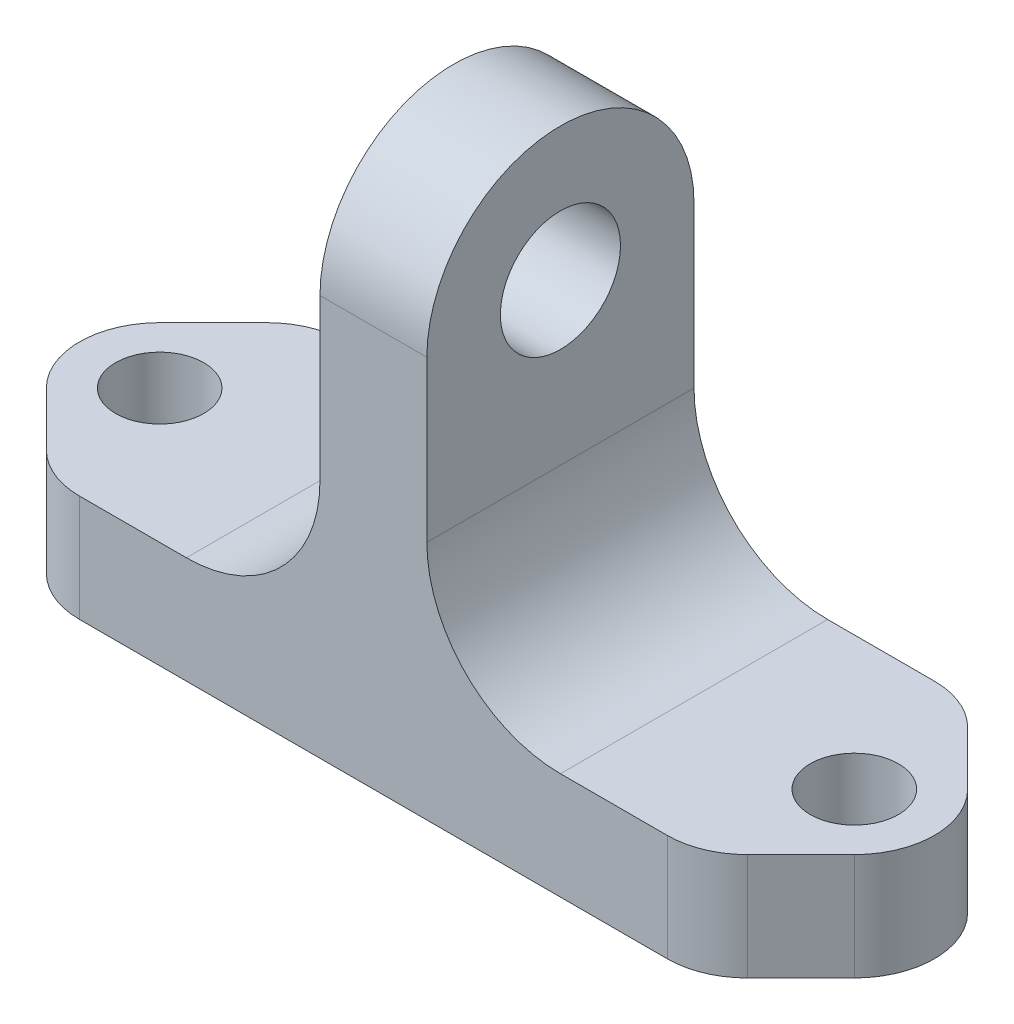
ISO-10303-21;
HEADER;
FILE_DESCRIPTION(('STEP AP214'),'2;1');
FILE_NAME('part.step','',(''),(''),'','','');
FILE_SCHEMA(('AUTOMOTIVE_DESIGN { 1 0 10303 214 1 1 1 1 }'));
ENDSEC;
DATA;
#1=APPLICATION_CONTEXT('core data for automotive mechanical design processes');
#2=APPLICATION_PROTOCOL_DEFINITION('international standard','automotive_design',2000,#1);
#3=PRODUCT_CONTEXT('',#1,'mechanical');
#4=PRODUCT('Part','Part','',(#3));
#5=PRODUCT_RELATED_PRODUCT_CATEGORY('part','',(#4));
#6=PRODUCT_DEFINITION_FORMATION('','',#4);
#7=PRODUCT_DEFINITION_CONTEXT('part definition',#1,'design');
#8=PRODUCT_DEFINITION('design','',#6,#7);
#9=PRODUCT_DEFINITION_SHAPE('','',#8);
#10=(LENGTH_UNIT() NAMED_UNIT(*) SI_UNIT(.MILLI.,.METRE.));
#11=(NAMED_UNIT(*) PLANE_ANGLE_UNIT() SI_UNIT($,.RADIAN.));
#12=(NAMED_UNIT(*) SI_UNIT($,.STERADIAN.) SOLID_ANGLE_UNIT());
#13=UNCERTAINTY_MEASURE_WITH_UNIT(LENGTH_MEASURE(1.E-05),#10,'distance_accuracy_value','');
#14=(GEOMETRIC_REPRESENTATION_CONTEXT(3) GLOBAL_UNCERTAINTY_ASSIGNED_CONTEXT((#13)) GLOBAL_UNIT_ASSIGNED_CONTEXT((#10,
#11,#12)) REPRESENTATION_CONTEXT('',''));
#15=CARTESIAN_POINT('',(0.,0.,0.));
#16=DIRECTION('',(0.,0.,1.));
#17=DIRECTION('',(1.,0.,0.));
#18=AXIS2_PLACEMENT_3D('',#15,#16,#17);
#19=CARTESIAN_POINT('',(-16.,0.,5.));
#20=DIRECTION('',(0.,1.,0.));
#21=DIRECTION('',(-1.,0.,0.));
#22=AXIS2_PLACEMENT_3D('',#19,#20,#21);
#23=PLANE('',#22);
#24=CARTESIAN_POINT('',(-13.,0.,0.));
#25=DIRECTION('',(0.,1.,0.));
#26=DIRECTION('',(0.,0.,1.));
#27=AXIS2_PLACEMENT_3D('',#24,#25,#26);
#28=CIRCLE('',#27,1.65);
#29=CARTESIAN_POINT('',(-13.,0.,1.65));
#30=VERTEX_POINT('',#29);
#31=EDGE_CURVE('E262',#30,#30,#28,.T.);
#32=ORIENTED_EDGE('',*,*,#31,.T.);
#33=EDGE_LOOP('',(#32));
#34=FACE_BOUND('',#33,.T.);
#35=CARTESIAN_POINT('',(13.,0.,0.));
#36=DIRECTION('',(0.,1.,0.));
#37=DIRECTION('',(0.,0.,1.));
#38=AXIS2_PLACEMENT_3D('',#35,#36,#37);
#39=CIRCLE('',#38,1.65);
#40=CARTESIAN_POINT('',(13.,0.,1.65));
#41=VERTEX_POINT('',#40);
#42=EDGE_CURVE('E248',#41,#41,#39,.T.);
#43=ORIENTED_EDGE('',*,*,#42,.T.);
#44=EDGE_LOOP('',(#43));
#45=FACE_BOUND('',#44,.T.);
#46=CARTESIAN_POINT('',(11.,0.,-2.));
#47=DIRECTION('',(0.,-1.,0.));
#48=DIRECTION('',(0.,0.,1.));
#49=AXIS2_PLACEMENT_3D('',#46,#47,#48);
#50=CIRCLE('',#49,3.);
#51=CARTESIAN_POINT('',(11.,0.,-5.));
#52=VERTEX_POINT('',#51);
#53=CARTESIAN_POINT('',(13.1213203435596,0.,-4.12132034355964));
#54=VERTEX_POINT('',#53);
#55=EDGE_CURVE('E166',#52,#54,#50,.T.);
#56=ORIENTED_EDGE('',*,*,#55,.T.);
#57=DIRECTION('',(-0.707106781186547,0.,-0.707106781186548));
#58=VECTOR('',#57,1.);
#59=CARTESIAN_POINT('',(8.62132034355965,0.,-8.62132034355964));
#60=LINE('',#59,#58);
#61=CARTESIAN_POINT('',(15.1213203435596,0.,-2.12132034355964));
#62=VERTEX_POINT('',#61);
#63=EDGE_CURVE('E172',#62,#54,#60,.T.);
#64=ORIENTED_EDGE('',*,*,#63,.F.);
#65=CARTESIAN_POINT('',(13.,0.,0.));
#66=DIRECTION('',(0.,-1.,0.));
#67=DIRECTION('',(0.,0.,1.));
#68=AXIS2_PLACEMENT_3D('',#65,#66,#67);
#69=CIRCLE('',#68,3.);
#70=CARTESIAN_POINT('',(15.1213203435596,0.,2.12132034355964));
#71=VERTEX_POINT('',#70);
#72=EDGE_CURVE('E322',#62,#71,#69,.T.);
#73=ORIENTED_EDGE('',*,*,#72,.T.);
#74=DIRECTION('',(-0.707106781186547,0.,0.707106781186548));
#75=VECTOR('',#74,1.);
#76=CARTESIAN_POINT('',(8.62132034355965,0.,8.62132034355964));
#77=LINE('',#76,#75);
#78=CARTESIAN_POINT('',(13.1213203435596,0.,4.12132034355964));
#79=VERTEX_POINT('',#78);
#80=EDGE_CURVE('E319',#71,#79,#77,.T.);
#81=ORIENTED_EDGE('',*,*,#80,.T.);
#82=CARTESIAN_POINT('',(11.,0.,2.));
#83=DIRECTION('',(0.,-1.,0.));
#84=DIRECTION('',(0.,0.,1.));
#85=AXIS2_PLACEMENT_3D('',#82,#83,#84);
#86=CIRCLE('',#85,3.);
#87=CARTESIAN_POINT('',(11.,0.,5.));
#88=VERTEX_POINT('',#87);
#89=EDGE_CURVE('E325',#79,#88,#86,.T.);
#90=ORIENTED_EDGE('',*,*,#89,.T.);
#91=DIRECTION('',(1.,0.,0.));
#92=VECTOR('',#91,1.);
#93=CARTESIAN_POINT('',(-16.,0.,5.));
#94=LINE('',#93,#92);
#95=CARTESIAN_POINT('',(-11.,0.,5.));
#96=VERTEX_POINT('',#95);
#97=EDGE_CURVE('E238',#96,#88,#94,.T.);
#98=ORIENTED_EDGE('',*,*,#97,.F.);
#99=CARTESIAN_POINT('',(-11.,0.,2.));
#100=DIRECTION('',(0.,1.,0.));
#101=DIRECTION('',(0.,0.,1.));
#102=AXIS2_PLACEMENT_3D('',#99,#100,#101);
#103=CIRCLE('',#102,3.);
#104=CARTESIAN_POINT('',(-13.1213203435596,0.,4.12132034355964));
#105=VERTEX_POINT('',#104);
#106=EDGE_CURVE('E58',#105,#96,#103,.T.);
#107=ORIENTED_EDGE('',*,*,#106,.F.);
#108=DIRECTION('',(0.707106781186547,0.,0.707106781186548));
#109=VECTOR('',#108,1.);
#110=CARTESIAN_POINT('',(-8.62132034355965,0.,8.62132034355964));
#111=LINE('',#110,#109);
#112=CARTESIAN_POINT('',(-15.1213203435596,0.,2.12132034355964));
#113=VERTEX_POINT('',#112);
#114=EDGE_CURVE('E283',#113,#105,#111,.T.);
#115=ORIENTED_EDGE('',*,*,#114,.F.);
#116=CARTESIAN_POINT('',(-13.,0.,0.));
#117=DIRECTION('',(0.,1.,0.));
#118=DIRECTION('',(0.,0.,1.));
#119=AXIS2_PLACEMENT_3D('',#116,#117,#118);
#120=CIRCLE('',#119,3.);
#121=CARTESIAN_POINT('',(-15.1213203435596,0.,-2.12132034355964));
#122=VERTEX_POINT('',#121);
#123=EDGE_CURVE('E280',#122,#113,#120,.T.);
#124=ORIENTED_EDGE('',*,*,#123,.F.);
#125=DIRECTION('',(0.707106781186547,0.,-0.707106781186548));
#126=VECTOR('',#125,1.);
#127=CARTESIAN_POINT('',(-8.62132034355965,0.,-8.62132034355964));
#128=LINE('',#127,#126);
#129=CARTESIAN_POINT('',(-13.1213203435596,0.,-4.12132034355964));
#130=VERTEX_POINT('',#129);
#131=EDGE_CURVE('E302',#122,#130,#128,.T.);
#132=ORIENTED_EDGE('',*,*,#131,.T.);
#133=CARTESIAN_POINT('',(-11.,0.,-2.));
#134=DIRECTION('',(0.,1.,0.));
#135=DIRECTION('',(0.,0.,1.));
#136=AXIS2_PLACEMENT_3D('',#133,#134,#135);
#137=CIRCLE('',#136,3.);
#138=CARTESIAN_POINT('',(-11.,0.,-5.));
#139=VERTEX_POINT('',#138);
#140=EDGE_CURVE('E305',#139,#130,#137,.T.);
#141=ORIENTED_EDGE('',*,*,#140,.F.);
#142=DIRECTION('',(1.,0.,0.));
#143=VECTOR('',#142,1.);
#144=CARTESIAN_POINT('',(-16.,0.,-5.));
#145=LINE('',#144,#143);
#146=EDGE_CURVE('E186',#139,#52,#145,.T.);
#147=ORIENTED_EDGE('',*,*,#146,.T.);
#148=EDGE_LOOP('',(#56,#64,#73,#81,#90,#98,#107,#115,#124,#132,#141,#147));
#149=FACE_BOUND('',#148,.T.);
#150=ADVANCED_FACE('F35',(#34,#45,#149),#23,.F.);
#151=CARTESIAN_POINT('',(16.,4.,5.));
#152=DIRECTION('',(0.,-1.,0.));
#153=DIRECTION('',(1.,0.,0.));
#154=AXIS2_PLACEMENT_3D('',#151,#152,#153);
#155=PLANE('',#154);
#156=CARTESIAN_POINT('',(13.,4.00000000000001,0.));
#157=DIRECTION('',(0.,1.,0.));
#158=DIRECTION('',(0.,0.,1.));
#159=AXIS2_PLACEMENT_3D('',#156,#157,#158);
#160=CIRCLE('',#159,1.64999999999999);
#161=CARTESIAN_POINT('',(13.,4.00000000000001,1.64999999999999));
#162=VERTEX_POINT('',#161);
#163=EDGE_CURVE('E251',#162,#162,#160,.T.);
#164=ORIENTED_EDGE('',*,*,#163,.F.);
#165=EDGE_LOOP('',(#164));
#166=FACE_BOUND('',#165,.T.);
#167=CARTESIAN_POINT('',(11.,4.,-2.));
#168=DIRECTION('',(0.,-1.,0.));
#169=DIRECTION('',(1.,0.,0.));
#170=AXIS2_PLACEMENT_3D('',#167,#168,#169);
#171=CIRCLE('',#170,3.);
#172=CARTESIAN_POINT('',(13.1213203435596,4.,-4.12132034355964));
#173=VERTEX_POINT('',#172);
#174=CARTESIAN_POINT('',(11.,4.,-5.));
#175=VERTEX_POINT('',#174);
#176=EDGE_CURVE('E163',#173,#175,#171,.F.);
#177=ORIENTED_EDGE('',*,*,#176,.T.);
#178=DIRECTION('',(-1.,0.,0.));
#179=VECTOR('',#178,1.);
#180=CARTESIAN_POINT('',(16.,4.,-5.));
#181=LINE('',#180,#179);
#182=CARTESIAN_POINT('',(7.,4.,-5.));
#183=VERTEX_POINT('',#182);
#184=EDGE_CURVE('E177',#175,#183,#181,.T.);
#185=ORIENTED_EDGE('',*,*,#184,.T.);
#186=DIRECTION('',(0.,0.,-1.));
#187=VECTOR('',#186,1.);
#188=CARTESIAN_POINT('',(7.,4.,5.));
#189=LINE('',#188,#187);
#190=CARTESIAN_POINT('',(7.,4.,5.));
#191=VERTEX_POINT('',#190);
#192=EDGE_CURVE('E214',#183,#191,#189,.F.);
#193=ORIENTED_EDGE('',*,*,#192,.T.);
#194=DIRECTION('',(-1.,0.,0.));
#195=VECTOR('',#194,1.);
#196=CARTESIAN_POINT('',(16.,4.,5.));
#197=LINE('',#196,#195);
#198=CARTESIAN_POINT('',(11.,4.,5.));
#199=VERTEX_POINT('',#198);
#200=EDGE_CURVE('E255',#199,#191,#197,.T.);
#201=ORIENTED_EDGE('',*,*,#200,.F.);
#202=CARTESIAN_POINT('',(11.,4.,2.));
#203=DIRECTION('',(0.,-1.,0.));
#204=DIRECTION('',(1.,0.,0.));
#205=AXIS2_PLACEMENT_3D('',#202,#203,#204);
#206=CIRCLE('',#205,3.);
#207=CARTESIAN_POINT('',(13.1213203435596,4.,4.12132034355964));
#208=VERTEX_POINT('',#207);
#209=EDGE_CURVE('E50',#199,#208,#206,.F.);
#210=ORIENTED_EDGE('',*,*,#209,.T.);
#211=DIRECTION('',(0.707106781186547,0.,-0.707106781186548));
#212=VECTOR('',#211,1.);
#213=CARTESIAN_POINT('',(8.62132034355965,4.,8.62132034355964));
#214=LINE('',#213,#212);
#215=CARTESIAN_POINT('',(15.1213203435596,4.,2.12132034355964));
#216=VERTEX_POINT('',#215);
#217=EDGE_CURVE('E310',#208,#216,#214,.T.);
#218=ORIENTED_EDGE('',*,*,#217,.T.);
#219=CARTESIAN_POINT('',(13.,4.,0.));
#220=DIRECTION('',(0.,-1.,0.));
#221=DIRECTION('',(1.,0.,0.));
#222=AXIS2_PLACEMENT_3D('',#219,#220,#221);
#223=CIRCLE('',#222,3.);
#224=CARTESIAN_POINT('',(15.1213203435596,4.,-2.12132034355964));
#225=VERTEX_POINT('',#224);
#226=EDGE_CURVE('E329',#216,#225,#223,.F.);
#227=ORIENTED_EDGE('',*,*,#226,.T.);
#228=DIRECTION('',(0.707106781186547,0.,0.707106781186548));
#229=VECTOR('',#228,1.);
#230=CARTESIAN_POINT('',(8.62132034355965,4.,-8.62132034355964));
#231=LINE('',#230,#229);
#232=EDGE_CURVE('E180',#173,#225,#231,.T.);
#233=ORIENTED_EDGE('',*,*,#232,.F.);
#234=EDGE_LOOP('',(#177,#185,#193,#201,#210,#218,#227,#233));
#235=FACE_BOUND('',#234,.T.);
#236=ADVANCED_FACE('F175',(#166,#235),#155,.F.);
#237=CARTESIAN_POINT('',(2.,15.,0.));
#238=DIRECTION('',(-1.,0.,0.));
#239=DIRECTION('',(0.,0.,1.));
#240=AXIS2_PLACEMENT_3D('',#237,#238,#239);
#241=CYLINDRICAL_SURFACE('',#240,5.);
#242=DIRECTION('',(1.,0.,0.));
#243=VECTOR('',#242,1.);
#244=CARTESIAN_POINT('',(2.,15.,5.));
#245=LINE('',#244,#243);
#246=CARTESIAN_POINT('',(2.,15.,5.));
#247=VERTEX_POINT('',#246);
#248=CARTESIAN_POINT('',(-2.,15.,5.));
#249=VERTEX_POINT('',#248);
#250=EDGE_CURVE('E194',#247,#249,#245,.F.);
#251=ORIENTED_EDGE('',*,*,#250,.F.);
#252=CARTESIAN_POINT('',(2.,15.,0.));
#253=DIRECTION('',(-1.,0.,0.));
#254=DIRECTION('',(0.,0.,1.));
#255=AXIS2_PLACEMENT_3D('',#252,#253,#254);
#256=CIRCLE('',#255,5.);
#257=CARTESIAN_POINT('',(2.,15.,-5.));
#258=VERTEX_POINT('',#257);
#259=EDGE_CURVE('E201',#258,#247,#256,.F.);
#260=ORIENTED_EDGE('',*,*,#259,.F.);
#261=DIRECTION('',(-1.,0.,0.));
#262=VECTOR('',#261,1.);
#263=CARTESIAN_POINT('',(0.,15.,-5.));
#264=LINE('',#263,#262);
#265=CARTESIAN_POINT('',(-2.,15.,-5.));
#266=VERTEX_POINT('',#265);
#267=EDGE_CURVE('E197',#266,#258,#264,.F.);
#268=ORIENTED_EDGE('',*,*,#267,.F.);
#269=CARTESIAN_POINT('',(-2.,15.,0.));
#270=DIRECTION('',(1.,0.,0.));
#271=DIRECTION('',(0.,1.,0.));
#272=AXIS2_PLACEMENT_3D('',#269,#270,#271);
#273=CIRCLE('',#272,5.);
#274=EDGE_CURVE('E204',#249,#266,#273,.F.);
#275=ORIENTED_EDGE('',*,*,#274,.F.);
#276=EDGE_LOOP('',(#251,#260,#268,#275));
#277=FACE_BOUND('',#276,.T.);
#278=ADVANCED_FACE('F375',(#277),#241,.T.);
#279=CARTESIAN_POINT('',(-2.,20.,5.));
#280=DIRECTION('',(1.,0.,0.));
#281=DIRECTION('',(0.,1.,0.));
#282=AXIS2_PLACEMENT_3D('',#279,#280,#281);
#283=PLANE('',#282);
#284=CARTESIAN_POINT('',(-2.,15.,0.));
#285=DIRECTION('',(1.,0.,0.));
#286=DIRECTION('',(0.,1.,0.));
#287=AXIS2_PLACEMENT_3D('',#284,#285,#286);
#288=CIRCLE('',#287,2.2479);
#289=CARTESIAN_POINT('',(-2.,17.2479,0.));
#290=VERTEX_POINT('',#289);
#291=EDGE_CURVE('E268',#290,#290,#288,.T.);
#292=ORIENTED_EDGE('',*,*,#291,.T.);
#293=EDGE_LOOP('',(#292));
#294=FACE_BOUND('',#293,.T.);
#295=DIRECTION('',(0.,-1.,0.));
#296=VECTOR('',#295,1.);
#297=CARTESIAN_POINT('',(-2.,20.,-5.));
#298=LINE('',#297,#296);
#299=CARTESIAN_POINT('',(-2.,9.,-5.));
#300=VERTEX_POINT('',#299);
#301=EDGE_CURVE('E243',#266,#300,#298,.T.);
#302=ORIENTED_EDGE('',*,*,#301,.T.);
#303=DIRECTION('',(0.,0.,-1.));
#304=VECTOR('',#303,1.);
#305=CARTESIAN_POINT('',(-2.,9.,5.));
#306=LINE('',#305,#304);
#307=CARTESIAN_POINT('',(-2.,9.,5.));
#308=VERTEX_POINT('',#307);
#309=EDGE_CURVE('E209',#300,#308,#306,.F.);
#310=ORIENTED_EDGE('',*,*,#309,.T.);
#311=DIRECTION('',(0.,-1.,0.));
#312=VECTOR('',#311,1.);
#313=CARTESIAN_POINT('',(-2.,20.,5.));
#314=LINE('',#313,#312);
#315=EDGE_CURVE('E188',#249,#308,#314,.T.);
#316=ORIENTED_EDGE('',*,*,#315,.F.);
#317=ORIENTED_EDGE('',*,*,#274,.T.);
#318=EDGE_LOOP('',(#302,#310,#316,#317));
#319=FACE_BOUND('',#318,.T.);
#320=ADVANCED_FACE('F246',(#294,#319),#283,.F.);
#321=CARTESIAN_POINT('',(-2.,4.,5.));
#322=DIRECTION('',(0.,-1.,0.));
#323=DIRECTION('',(1.,0.,0.));
#324=AXIS2_PLACEMENT_3D('',#321,#322,#323);
#325=PLANE('',#324);
#326=DIRECTION('',(-1.,0.,0.));
#327=VECTOR('',#326,1.);
#328=CARTESIAN_POINT('',(-2.,4.,-5.));
#329=LINE('',#328,#327);
#330=CARTESIAN_POINT('',(-7.,4.,-5.));
#331=VERTEX_POINT('',#330);
#332=CARTESIAN_POINT('',(-11.,4.,-5.));
#333=VERTEX_POINT('',#332);
#334=EDGE_CURVE('E190',#331,#333,#329,.T.);
#335=ORIENTED_EDGE('',*,*,#334,.T.);
#336=CARTESIAN_POINT('',(-11.,4.,-2.));
#337=DIRECTION('',(0.,-1.,0.));
#338=DIRECTION('',(1.,0.,0.));
#339=AXIS2_PLACEMENT_3D('',#336,#337,#338);
#340=CIRCLE('',#339,3.);
#341=CARTESIAN_POINT('',(-13.1213203435596,4.,-4.12132034355964));
#342=VERTEX_POINT('',#341);
#343=EDGE_CURVE('E308',#342,#333,#340,.T.);
#344=ORIENTED_EDGE('',*,*,#343,.F.);
#345=DIRECTION('',(-0.707106781186547,0.,0.707106781186548));
#346=VECTOR('',#345,1.);
#347=CARTESIAN_POINT('',(-8.62132034355965,4.,-8.62132034355964));
#348=LINE('',#347,#346);
#349=CARTESIAN_POINT('',(-15.1213203435596,4.,-2.12132034355964));
#350=VERTEX_POINT('',#349);
#351=EDGE_CURVE('E292',#342,#350,#348,.T.);
#352=ORIENTED_EDGE('',*,*,#351,.T.);
#353=CARTESIAN_POINT('',(-13.,4.,0.));
#354=DIRECTION('',(0.,-1.,0.));
#355=DIRECTION('',(1.,0.,0.));
#356=AXIS2_PLACEMENT_3D('',#353,#354,#355);
#357=CIRCLE('',#356,3.);
#358=CARTESIAN_POINT('',(-15.1213203435596,4.,2.12132034355964));
#359=VERTEX_POINT('',#358);
#360=EDGE_CURVE('E290',#359,#350,#357,.T.);
#361=ORIENTED_EDGE('',*,*,#360,.F.);
#362=DIRECTION('',(-0.707106781186547,0.,-0.707106781186548));
#363=VECTOR('',#362,1.);
#364=CARTESIAN_POINT('',(-8.62132034355965,4.,8.62132034355964));
#365=LINE('',#364,#363);
#366=CARTESIAN_POINT('',(-13.1213203435596,4.,4.12132034355964));
#367=VERTEX_POINT('',#366);
#368=EDGE_CURVE('E288',#367,#359,#365,.T.);
#369=ORIENTED_EDGE('',*,*,#368,.F.);
#370=CARTESIAN_POINT('',(-11.,4.,2.));
#371=DIRECTION('',(0.,-1.,0.));
#372=DIRECTION('',(1.,0.,0.));
#373=AXIS2_PLACEMENT_3D('',#370,#371,#372);
#374=CIRCLE('',#373,3.);
#375=CARTESIAN_POINT('',(-11.,4.,5.));
#376=VERTEX_POINT('',#375);
#377=EDGE_CURVE('E237',#376,#367,#374,.T.);
#378=ORIENTED_EDGE('',*,*,#377,.F.);
#379=DIRECTION('',(-1.,0.,0.));
#380=VECTOR('',#379,1.);
#381=CARTESIAN_POINT('',(-2.,4.,5.));
#382=LINE('',#381,#380);
#383=CARTESIAN_POINT('',(-7.,4.,5.));
#384=VERTEX_POINT('',#383);
#385=EDGE_CURVE('E225',#384,#376,#382,.T.);
#386=ORIENTED_EDGE('',*,*,#385,.F.);
#387=DIRECTION('',(0.,0.,-1.));
#388=VECTOR('',#387,1.);
#389=CARTESIAN_POINT('',(-7.,4.,-5.));
#390=LINE('',#389,#388);
#391=EDGE_CURVE('E206',#384,#331,#390,.T.);
#392=ORIENTED_EDGE('',*,*,#391,.T.);
#393=EDGE_LOOP('',(#335,#344,#352,#361,#369,#378,#386,#392));
#394=FACE_BOUND('',#393,.T.);
#395=CARTESIAN_POINT('',(-13.,4.,0.));
#396=DIRECTION('',(0.,1.,0.));
#397=DIRECTION('',(0.,0.,1.));
#398=AXIS2_PLACEMENT_3D('',#395,#396,#397);
#399=CIRCLE('',#398,1.64999999999999);
#400=CARTESIAN_POINT('',(-13.,4.,1.64999999999999));
#401=VERTEX_POINT('',#400);
#402=EDGE_CURVE('E265',#401,#401,#399,.T.);
#403=ORIENTED_EDGE('',*,*,#402,.F.);
#404=EDGE_LOOP('',(#403));
#405=FACE_BOUND('',#404,.T.);
#406=ADVANCED_FACE('F233',(#394,#405),#325,.F.);
#407=CARTESIAN_POINT('',(2.,4.,5.));
#408=DIRECTION('',(-1.,0.,0.));
#409=DIRECTION('',(0.,0.,1.));
#410=AXIS2_PLACEMENT_3D('',#407,#408,#409);
#411=PLANE('',#410);
#412=CARTESIAN_POINT('',(2.,15.,0.));
#413=DIRECTION('',(1.,0.,0.));
#414=DIRECTION('',(0.,0.,-1.));
#415=AXIS2_PLACEMENT_3D('',#412,#413,#414);
#416=CIRCLE('',#415,2.2479);
#417=CARTESIAN_POINT('',(2.,15.,-2.2479));
#418=VERTEX_POINT('',#417);
#419=EDGE_CURVE('E271',#418,#418,#416,.T.);
#420=ORIENTED_EDGE('',*,*,#419,.F.);
#421=EDGE_LOOP('',(#420));
#422=FACE_BOUND('',#421,.T.);
#423=DIRECTION('',(0.,1.,0.));
#424=VECTOR('',#423,1.);
#425=CARTESIAN_POINT('',(2.,4.,5.));
#426=LINE('',#425,#424);
#427=CARTESIAN_POINT('',(2.,9.,5.));
#428=VERTEX_POINT('',#427);
#429=EDGE_CURVE('E198',#428,#247,#426,.T.);
#430=ORIENTED_EDGE('',*,*,#429,.F.);
#431=DIRECTION('',(0.,0.,-1.));
#432=VECTOR('',#431,1.);
#433=CARTESIAN_POINT('',(2.,9.,-5.));
#434=LINE('',#433,#432);
#435=CARTESIAN_POINT('',(2.,9.,-5.));
#436=VERTEX_POINT('',#435);
#437=EDGE_CURVE('E211',#428,#436,#434,.T.);
#438=ORIENTED_EDGE('',*,*,#437,.T.);
#439=DIRECTION('',(0.,1.,0.));
#440=VECTOR('',#439,1.);
#441=CARTESIAN_POINT('',(2.,4.,-5.));
#442=LINE('',#441,#440);
#443=EDGE_CURVE('E185',#436,#258,#442,.T.);
#444=ORIENTED_EDGE('',*,*,#443,.T.);
#445=ORIENTED_EDGE('',*,*,#259,.T.);
#446=EDGE_LOOP('',(#430,#438,#444,#445));
#447=FACE_BOUND('',#446,.T.);
#448=ADVANCED_FACE('F371',(#422,#447),#411,.F.);
#449=CARTESIAN_POINT('',(0.,0.,5.));
#450=DIRECTION('',(0.,0.,1.));
#451=DIRECTION('',(1.,0.,0.));
#452=AXIS2_PLACEMENT_3D('',#449,#450,#451);
#453=PLANE('',#452);
#454=DIRECTION('',(0.,-1.,0.));
#455=VECTOR('',#454,1.);
#456=CARTESIAN_POINT('',(11.,20.001,5.));
#457=LINE('',#456,#455);
#458=EDGE_CURVE('E313',#199,#88,#457,.T.);
#459=ORIENTED_EDGE('',*,*,#458,.F.);
#460=ORIENTED_EDGE('',*,*,#200,.T.);
#461=CARTESIAN_POINT('',(7.,9.,5.));
#462=DIRECTION('',(0.,0.,1.));
#463=DIRECTION('',(1.,0.,0.));
#464=AXIS2_PLACEMENT_3D('',#461,#462,#463);
#465=CIRCLE('',#464,5.);
#466=EDGE_CURVE('E11',#191,#428,#465,.F.);
#467=ORIENTED_EDGE('',*,*,#466,.T.);
#468=ORIENTED_EDGE('',*,*,#429,.T.);
#469=ORIENTED_EDGE('',*,*,#250,.T.);
#470=ORIENTED_EDGE('',*,*,#315,.T.);
#471=CARTESIAN_POINT('',(-7.,9.,5.));
#472=DIRECTION('',(0.,0.,1.));
#473=DIRECTION('',(1.,0.,0.));
#474=AXIS2_PLACEMENT_3D('',#471,#472,#473);
#475=CIRCLE('',#474,5.);
#476=EDGE_CURVE('E218',#308,#384,#475,.F.);
#477=ORIENTED_EDGE('',*,*,#476,.T.);
#478=ORIENTED_EDGE('',*,*,#385,.T.);
#479=DIRECTION('',(0.,-1.,0.));
#480=VECTOR('',#479,1.);
#481=CARTESIAN_POINT('',(-11.,20.001,5.));
#482=LINE('',#481,#480);
#483=EDGE_CURVE('E278',#376,#96,#482,.T.);
#484=ORIENTED_EDGE('',*,*,#483,.T.);
#485=ORIENTED_EDGE('',*,*,#97,.T.);
#486=EDGE_LOOP('',(#459,#460,#467,#468,#469,#470,#477,#478,#484,#485));
#487=FACE_BOUND('',#486,.T.);
#488=ADVANCED_FACE('F224',(#487),#453,.T.);
#489=CARTESIAN_POINT('',(0.,0.,-5.));
#490=DIRECTION('',(0.,0.,1.));
#491=DIRECTION('',(1.,0.,0.));
#492=AXIS2_PLACEMENT_3D('',#489,#490,#491);
#493=PLANE('',#492);
#494=ORIENTED_EDGE('',*,*,#184,.F.);
#495=DIRECTION('',(0.,-1.,0.));
#496=VECTOR('',#495,1.);
#497=CARTESIAN_POINT('',(11.,20.001,-5.));
#498=LINE('',#497,#496);
#499=EDGE_CURVE('E160',#175,#52,#498,.T.);
#500=ORIENTED_EDGE('',*,*,#499,.T.);
#501=ORIENTED_EDGE('',*,*,#146,.F.);
#502=DIRECTION('',(0.,-1.,0.));
#503=VECTOR('',#502,1.);
#504=CARTESIAN_POINT('',(-11.,20.001,-5.));
#505=LINE('',#504,#503);
#506=EDGE_CURVE('E295',#333,#139,#505,.T.);
#507=ORIENTED_EDGE('',*,*,#506,.F.);
#508=ORIENTED_EDGE('',*,*,#334,.F.);
#509=CARTESIAN_POINT('',(-7.,9.,-5.));
#510=DIRECTION('',(0.,0.,1.));
#511=DIRECTION('',(1.,0.,0.));
#512=AXIS2_PLACEMENT_3D('',#509,#510,#511);
#513=CIRCLE('',#512,5.);
#514=EDGE_CURVE('E216',#331,#300,#513,.T.);
#515=ORIENTED_EDGE('',*,*,#514,.T.);
#516=ORIENTED_EDGE('',*,*,#301,.F.);
#517=ORIENTED_EDGE('',*,*,#267,.T.);
#518=ORIENTED_EDGE('',*,*,#443,.F.);
#519=CARTESIAN_POINT('',(7.,9.,-5.));
#520=DIRECTION('',(0.,0.,1.));
#521=DIRECTION('',(1.,0.,0.));
#522=AXIS2_PLACEMENT_3D('',#519,#520,#521);
#523=CIRCLE('',#522,5.);
#524=EDGE_CURVE('E43',#436,#183,#523,.T.);
#525=ORIENTED_EDGE('',*,*,#524,.T.);
#526=EDGE_LOOP('',(#494,#500,#501,#507,#508,#515,#516,#517,#518,#525));
#527=FACE_BOUND('',#526,.T.);
#528=ADVANCED_FACE('F182',(#527),#493,.F.);
#529=CARTESIAN_POINT('',(13.,4.,0.));
#530=DIRECTION('',(0.,1.,0.));
#531=DIRECTION('',(0.,0.,1.));
#532=AXIS2_PLACEMENT_3D('',#529,#530,#531);
#533=CYLINDRICAL_SURFACE('',#532,1.64999999999999);
#534=ORIENTED_EDGE('',*,*,#42,.F.);
#535=EDGE_LOOP('',(#534));
#536=FACE_BOUND('',#535,.T.);
#537=ORIENTED_EDGE('',*,*,#163,.T.);
#538=EDGE_LOOP('',(#537));
#539=FACE_BOUND('',#538,.T.);
#540=ADVANCED_FACE('F407',(#536,#539),#533,.F.);
#541=CARTESIAN_POINT('',(-13.,4.,0.));
#542=DIRECTION('',(0.,1.,0.));
#543=DIRECTION('',(0.,0.,1.));
#544=AXIS2_PLACEMENT_3D('',#541,#542,#543);
#545=CYLINDRICAL_SURFACE('',#544,1.64999999999999);
#546=ORIENTED_EDGE('',*,*,#31,.F.);
#547=EDGE_LOOP('',(#546));
#548=FACE_BOUND('',#547,.T.);
#549=ORIENTED_EDGE('',*,*,#402,.T.);
#550=EDGE_LOOP('',(#549));
#551=FACE_BOUND('',#550,.T.);
#552=ADVANCED_FACE('F411',(#548,#551),#545,.F.);
#553=CARTESIAN_POINT('',(-7.,9.,5.));
#554=DIRECTION('',(0.,0.,1.));
#555=DIRECTION('',(1.,0.,0.));
#556=AXIS2_PLACEMENT_3D('',#553,#554,#555);
#557=CYLINDRICAL_SURFACE('',#556,5.);
#558=ORIENTED_EDGE('',*,*,#476,.F.);
#559=ORIENTED_EDGE('',*,*,#309,.F.);
#560=ORIENTED_EDGE('',*,*,#514,.F.);
#561=ORIENTED_EDGE('',*,*,#391,.F.);
#562=EDGE_LOOP('',(#558,#559,#560,#561));
#563=FACE_BOUND('',#562,.T.);
#564=ADVANCED_FACE('F240',(#563),#557,.F.);
#565=CARTESIAN_POINT('',(7.,9.,5.));
#566=DIRECTION('',(0.,0.,1.));
#567=DIRECTION('',(1.,0.,0.));
#568=AXIS2_PLACEMENT_3D('',#565,#566,#567);
#569=CYLINDRICAL_SURFACE('',#568,5.);
#570=ORIENTED_EDGE('',*,*,#466,.F.);
#571=ORIENTED_EDGE('',*,*,#192,.F.);
#572=ORIENTED_EDGE('',*,*,#524,.F.);
#573=ORIENTED_EDGE('',*,*,#437,.F.);
#574=EDGE_LOOP('',(#570,#571,#572,#573));
#575=FACE_BOUND('',#574,.T.);
#576=ADVANCED_FACE('F37',(#575),#569,.F.);
#577=CARTESIAN_POINT('',(2.,15.,0.));
#578=DIRECTION('',(1.,0.,0.));
#579=DIRECTION('',(0.,0.,-1.));
#580=AXIS2_PLACEMENT_3D('',#577,#578,#579);
#581=CYLINDRICAL_SURFACE('',#580,2.2479);
#582=ORIENTED_EDGE('',*,*,#291,.F.);
#583=EDGE_LOOP('',(#582));
#584=FACE_BOUND('',#583,.T.);
#585=ORIENTED_EDGE('',*,*,#419,.T.);
#586=EDGE_LOOP('',(#585));
#587=FACE_BOUND('',#586,.T.);
#588=ADVANCED_FACE('F416',(#584,#587),#581,.F.);
#589=CARTESIAN_POINT('',(-11.,20.001,2.));
#590=DIRECTION('',(0.,-1.,0.));
#591=DIRECTION('',(0.,0.,-1.));
#592=AXIS2_PLACEMENT_3D('',#589,#590,#591);
#593=CYLINDRICAL_SURFACE('',#592,3.);
#594=ORIENTED_EDGE('',*,*,#377,.T.);
#595=DIRECTION('',(0.,-1.,0.));
#596=VECTOR('',#595,1.);
#597=CARTESIAN_POINT('',(-13.1213203435596,20.001,4.12132034355964));
#598=LINE('',#597,#596);
#599=EDGE_CURVE('E274',#367,#105,#598,.T.);
#600=ORIENTED_EDGE('',*,*,#599,.T.);
#601=ORIENTED_EDGE('',*,*,#106,.T.);
#602=ORIENTED_EDGE('',*,*,#483,.F.);
#603=EDGE_LOOP('',(#594,#600,#601,#602));
#604=FACE_BOUND('',#603,.T.);
#605=ADVANCED_FACE('F360',(#604),#593,.T.);
#606=CARTESIAN_POINT('',(-8.62132034355965,20.001,8.62132034355964));
#607=DIRECTION('',(0.707106781186548,0.,-0.707106781186547));
#608=DIRECTION('',(-0.707106781186547,0.,-0.707106781186548));
#609=AXIS2_PLACEMENT_3D('',#606,#607,#608);
#610=PLANE('',#609);
#611=ORIENTED_EDGE('',*,*,#368,.T.);
#612=DIRECTION('',(0.,-1.,0.));
#613=VECTOR('',#612,1.);
#614=CARTESIAN_POINT('',(-15.1213203435596,20.001,2.12132034355964));
#615=LINE('',#614,#613);
#616=EDGE_CURVE('E276',#359,#113,#615,.T.);
#617=ORIENTED_EDGE('',*,*,#616,.T.);
#618=ORIENTED_EDGE('',*,*,#114,.T.);
#619=ORIENTED_EDGE('',*,*,#599,.F.);
#620=EDGE_LOOP('',(#611,#617,#618,#619));
#621=FACE_BOUND('',#620,.T.);
#622=ADVANCED_FACE('F359',(#621),#610,.F.);
#623=CARTESIAN_POINT('',(-13.,20.001,0.));
#624=DIRECTION('',(0.,-1.,0.));
#625=DIRECTION('',(0.,0.,-1.));
#626=AXIS2_PLACEMENT_3D('',#623,#624,#625);
#627=CYLINDRICAL_SURFACE('',#626,3.);
#628=ORIENTED_EDGE('',*,*,#360,.T.);
#629=DIRECTION('',(0.,-1.,0.));
#630=VECTOR('',#629,1.);
#631=CARTESIAN_POINT('',(-15.1213203435596,20.001,-2.12132034355964));
#632=LINE('',#631,#630);
#633=EDGE_CURVE('E297',#350,#122,#632,.T.);
#634=ORIENTED_EDGE('',*,*,#633,.T.);
#635=ORIENTED_EDGE('',*,*,#123,.T.);
#636=ORIENTED_EDGE('',*,*,#616,.F.);
#637=EDGE_LOOP('',(#628,#634,#635,#636));
#638=FACE_BOUND('',#637,.T.);
#639=ADVANCED_FACE('F354',(#638),#627,.T.);
#640=CARTESIAN_POINT('',(-11.,20.001,-2.));
#641=DIRECTION('',(0.,-1.,0.));
#642=DIRECTION('',(0.,0.,-1.));
#643=AXIS2_PLACEMENT_3D('',#640,#641,#642);
#644=CYLINDRICAL_SURFACE('',#643,3.);
#645=ORIENTED_EDGE('',*,*,#343,.T.);
#646=ORIENTED_EDGE('',*,*,#506,.T.);
#647=ORIENTED_EDGE('',*,*,#140,.T.);
#648=DIRECTION('',(0.,-1.,0.));
#649=VECTOR('',#648,1.);
#650=CARTESIAN_POINT('',(-13.1213203435596,20.001,-4.12132034355964));
#651=LINE('',#650,#649);
#652=EDGE_CURVE('E300',#342,#130,#651,.T.);
#653=ORIENTED_EDGE('',*,*,#652,.F.);
#654=EDGE_LOOP('',(#645,#646,#647,#653));
#655=FACE_BOUND('',#654,.T.);
#656=ADVANCED_FACE('F348',(#655),#644,.T.);
#657=CARTESIAN_POINT('',(-8.62132034355965,20.001,-8.62132034355964));
#658=DIRECTION('',(-0.707106781186548,0.,-0.707106781186547));
#659=DIRECTION('',(-0.707106781186547,0.,0.707106781186548));
#660=AXIS2_PLACEMENT_3D('',#657,#658,#659);
#661=PLANE('',#660);
#662=ORIENTED_EDGE('',*,*,#652,.T.);
#663=ORIENTED_EDGE('',*,*,#131,.F.);
#664=ORIENTED_EDGE('',*,*,#633,.F.);
#665=ORIENTED_EDGE('',*,*,#351,.F.);
#666=EDGE_LOOP('',(#662,#663,#664,#665));
#667=FACE_BOUND('',#666,.T.);
#668=ADVANCED_FACE('F351',(#667),#661,.T.);
#669=CARTESIAN_POINT('',(11.,20.001,2.));
#670=DIRECTION('',(0.,-1.,0.));
#671=DIRECTION('',(0.,0.,-1.));
#672=AXIS2_PLACEMENT_3D('',#669,#670,#671);
#673=CYLINDRICAL_SURFACE('',#672,3.);
#674=ORIENTED_EDGE('',*,*,#458,.T.);
#675=ORIENTED_EDGE('',*,*,#89,.F.);
#676=DIRECTION('',(0.,-1.,0.));
#677=VECTOR('',#676,1.);
#678=CARTESIAN_POINT('',(13.1213203435596,20.001,4.12132034355964));
#679=LINE('',#678,#677);
#680=EDGE_CURVE('E317',#208,#79,#679,.T.);
#681=ORIENTED_EDGE('',*,*,#680,.F.);
#682=ORIENTED_EDGE('',*,*,#209,.F.);
#683=EDGE_LOOP('',(#674,#675,#681,#682));
#684=FACE_BOUND('',#683,.T.);
#685=ADVANCED_FACE('F364',(#684),#673,.T.);
#686=CARTESIAN_POINT('',(13.,20.001,0.));
#687=DIRECTION('',(0.,-1.,0.));
#688=DIRECTION('',(0.,0.,-1.));
#689=AXIS2_PLACEMENT_3D('',#686,#687,#688);
#690=CYLINDRICAL_SURFACE('',#689,3.);
#691=DIRECTION('',(0.,-1.,0.));
#692=VECTOR('',#691,1.);
#693=CARTESIAN_POINT('',(15.1213203435596,20.001,2.12132034355964));
#694=LINE('',#693,#692);
#695=EDGE_CURVE('E315',#216,#71,#694,.T.);
#696=ORIENTED_EDGE('',*,*,#695,.T.);
#697=ORIENTED_EDGE('',*,*,#72,.F.);
#698=DIRECTION('',(0.,-1.,0.));
#699=VECTOR('',#698,1.);
#700=CARTESIAN_POINT('',(15.1213203435596,20.001,-2.12132034355964));
#701=LINE('',#700,#699);
#702=EDGE_CURVE('E171',#225,#62,#701,.T.);
#703=ORIENTED_EDGE('',*,*,#702,.F.);
#704=ORIENTED_EDGE('',*,*,#226,.F.);
#705=EDGE_LOOP('',(#696,#697,#703,#704));
#706=FACE_BOUND('',#705,.T.);
#707=ADVANCED_FACE('F432',(#706),#690,.T.);
#708=CARTESIAN_POINT('',(8.62132034355965,20.001,8.62132034355964));
#709=DIRECTION('',(0.707106781186548,0.,0.707106781186547));
#710=DIRECTION('',(0.707106781186547,0.,-0.707106781186548));
#711=AXIS2_PLACEMENT_3D('',#708,#709,#710);
#712=PLANE('',#711);
#713=ORIENTED_EDGE('',*,*,#680,.T.);
#714=ORIENTED_EDGE('',*,*,#80,.F.);
#715=ORIENTED_EDGE('',*,*,#695,.F.);
#716=ORIENTED_EDGE('',*,*,#217,.F.);
#717=EDGE_LOOP('',(#713,#714,#715,#716));
#718=FACE_BOUND('',#717,.T.);
#719=ADVANCED_FACE('F435',(#718),#712,.T.);
#720=CARTESIAN_POINT('',(11.,20.001,-2.));
#721=DIRECTION('',(0.,-1.,0.));
#722=DIRECTION('',(0.,0.,-1.));
#723=AXIS2_PLACEMENT_3D('',#720,#721,#722);
#724=CYLINDRICAL_SURFACE('',#723,3.);
#725=DIRECTION('',(0.,-1.,0.));
#726=VECTOR('',#725,1.);
#727=CARTESIAN_POINT('',(13.1213203435596,20.001,-4.12132034355964));
#728=LINE('',#727,#726);
#729=EDGE_CURVE('E331',#173,#54,#728,.T.);
#730=ORIENTED_EDGE('',*,*,#729,.T.);
#731=ORIENTED_EDGE('',*,*,#55,.F.);
#732=ORIENTED_EDGE('',*,*,#499,.F.);
#733=ORIENTED_EDGE('',*,*,#176,.F.);
#734=EDGE_LOOP('',(#730,#731,#732,#733));
#735=FACE_BOUND('',#734,.T.);
#736=ADVANCED_FACE('F162',(#735),#724,.T.);
#737=CARTESIAN_POINT('',(8.62132034355965,20.001,-8.62132034355964));
#738=DIRECTION('',(-0.707106781186548,0.,0.707106781186547));
#739=DIRECTION('',(0.707106781186547,0.,0.707106781186548));
#740=AXIS2_PLACEMENT_3D('',#737,#738,#739);
#741=PLANE('',#740);
#742=ORIENTED_EDGE('',*,*,#232,.T.);
#743=ORIENTED_EDGE('',*,*,#702,.T.);
#744=ORIENTED_EDGE('',*,*,#63,.T.);
#745=ORIENTED_EDGE('',*,*,#729,.F.);
#746=EDGE_LOOP('',(#742,#743,#744,#745));
#747=FACE_BOUND('',#746,.T.);
#748=ADVANCED_FACE('F339',(#747),#741,.F.);
#749=CLOSED_SHELL('',(#150,#236,#278,#320,#406,#448,#488,#528,#540,#552,#564,#576,#588,#605,
#622,#639,#656,#668,#685,#707,#719,#736,#748));
#750=MANIFOLD_SOLID_BREP('B2',#749);
#751=ADVANCED_BREP_SHAPE_REPRESENTATION('',(#18,#750),#14);
#752=SHAPE_DEFINITION_REPRESENTATION(#9,#751);
ENDSEC;
END-ISO-10303-21;
